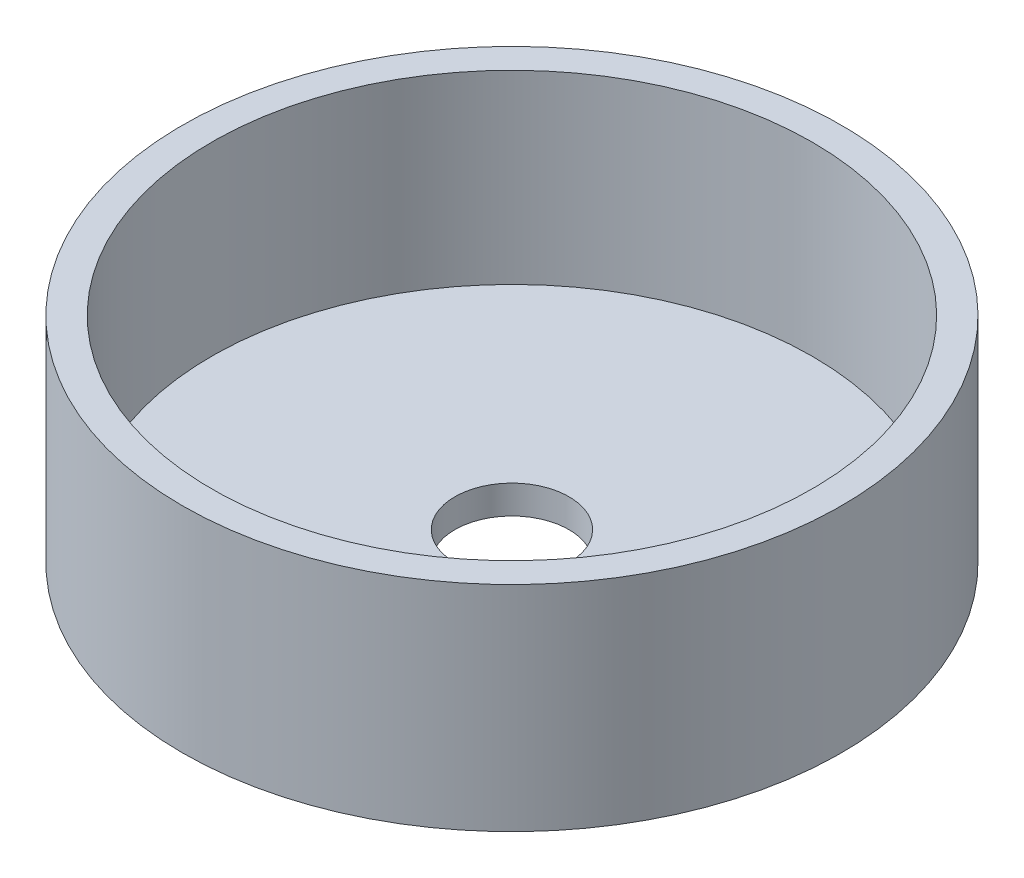
ISO-10303-21;
HEADER;
FILE_DESCRIPTION(('STEP AP214'),'2;1');
FILE_NAME('part.step','',(''),(''),'','','');
FILE_SCHEMA(('AUTOMOTIVE_DESIGN { 1 0 10303 214 1 1 1 1 }'));
ENDSEC;
DATA;
#1=APPLICATION_CONTEXT('core data for automotive mechanical design processes');
#2=APPLICATION_PROTOCOL_DEFINITION('international standard','automotive_design',2000,#1);
#3=PRODUCT_CONTEXT('',#1,'mechanical');
#4=PRODUCT('Part','Part','',(#3));
#5=PRODUCT_RELATED_PRODUCT_CATEGORY('part','',(#4));
#6=PRODUCT_DEFINITION_FORMATION('','',#4);
#7=PRODUCT_DEFINITION_CONTEXT('part definition',#1,'design');
#8=PRODUCT_DEFINITION('design','',#6,#7);
#9=PRODUCT_DEFINITION_SHAPE('','',#8);
#10=(LENGTH_UNIT() NAMED_UNIT(*) SI_UNIT(.MILLI.,.METRE.));
#11=(NAMED_UNIT(*) PLANE_ANGLE_UNIT() SI_UNIT($,.RADIAN.));
#12=(NAMED_UNIT(*) SI_UNIT($,.STERADIAN.) SOLID_ANGLE_UNIT());
#13=UNCERTAINTY_MEASURE_WITH_UNIT(LENGTH_MEASURE(1.E-05),#10,'distance_accuracy_value','');
#14=(GEOMETRIC_REPRESENTATION_CONTEXT(3) GLOBAL_UNCERTAINTY_ASSIGNED_CONTEXT((#13)) GLOBAL_UNIT_ASSIGNED_CONTEXT((#10,
#11,#12)) REPRESENTATION_CONTEXT('',''));
#15=CARTESIAN_POINT('',(0.,0.,0.));
#16=DIRECTION('',(0.,0.,1.));
#17=DIRECTION('',(1.,0.,0.));
#18=AXIS2_PLACEMENT_3D('',#15,#16,#17);
#19=CARTESIAN_POINT('',(0.,2.,0.));
#20=DIRECTION('',(0.,-1.,0.));
#21=DIRECTION('',(0.,0.,-1.));
#22=AXIS2_PLACEMENT_3D('',#19,#20,#21);
#23=CYLINDRICAL_SURFACE('',#22,23.1);
#24=CARTESIAN_POINT('',(0.,0.,0.));
#25=DIRECTION('',(0.,1.,0.));
#26=DIRECTION('',(0.,0.,1.));
#27=AXIS2_PLACEMENT_3D('',#24,#25,#26);
#28=CIRCLE('',#27,23.1);
#29=CARTESIAN_POINT('',(0.,0.,23.1));
#30=VERTEX_POINT('',#29);
#31=EDGE_CURVE('E40',#30,#30,#28,.T.);
#32=ORIENTED_EDGE('',*,*,#31,.T.);
#33=EDGE_LOOP('',(#32));
#34=FACE_BOUND('',#33,.T.);
#35=CARTESIAN_POINT('',(0.,15.,0.));
#36=DIRECTION('',(0.,1.,0.));
#37=DIRECTION('',(0.,0.,1.));
#38=AXIS2_PLACEMENT_3D('',#35,#36,#37);
#39=CIRCLE('',#38,23.1);
#40=CARTESIAN_POINT('',(0.,15.,23.1));
#41=VERTEX_POINT('',#40);
#42=EDGE_CURVE('E44',#41,#41,#39,.T.);
#43=ORIENTED_EDGE('',*,*,#42,.F.);
#44=EDGE_LOOP('',(#43));
#45=FACE_BOUND('',#44,.T.);
#46=ADVANCED_FACE('F34',(#34,#45),#23,.T.);
#47=CARTESIAN_POINT('',(0.,0.,0.));
#48=DIRECTION('',(0.,1.,0.));
#49=DIRECTION('',(0.,0.,1.));
#50=AXIS2_PLACEMENT_3D('',#47,#48,#49);
#51=PLANE('',#50);
#52=CARTESIAN_POINT('',(0.,0.,0.));
#53=DIRECTION('',(0.,1.,0.));
#54=DIRECTION('',(0.,0.,1.));
#55=AXIS2_PLACEMENT_3D('',#52,#53,#54);
#56=CIRCLE('',#55,4.);
#57=CARTESIAN_POINT('',(0.,0.,4.));
#58=VERTEX_POINT('',#57);
#59=EDGE_CURVE('E53',#58,#58,#56,.T.);
#60=ORIENTED_EDGE('',*,*,#59,.T.);
#61=EDGE_LOOP('',(#60));
#62=FACE_BOUND('',#61,.T.);
#63=ORIENTED_EDGE('',*,*,#31,.F.);
#64=EDGE_LOOP('',(#63));
#65=FACE_BOUND('',#64,.T.);
#66=ADVANCED_FACE('F60',(#62,#65),#51,.F.);
#67=CARTESIAN_POINT('',(0.,15.,0.));
#68=DIRECTION('',(0.,1.,0.));
#69=DIRECTION('',(0.,0.,1.));
#70=AXIS2_PLACEMENT_3D('',#67,#68,#69);
#71=PLANE('',#70);
#72=ORIENTED_EDGE('',*,*,#42,.T.);
#73=EDGE_LOOP('',(#72));
#74=FACE_BOUND('',#73,.T.);
#75=CARTESIAN_POINT('',(0.,15.,0.));
#76=DIRECTION('',(0.,1.,0.));
#77=DIRECTION('',(0.,0.,1.));
#78=AXIS2_PLACEMENT_3D('',#75,#76,#77);
#79=CIRCLE('',#78,21.05);
#80=CARTESIAN_POINT('',(0.,15.,-21.05));
#81=VERTEX_POINT('',#80);
#82=EDGE_CURVE('E48',#81,#81,#79,.T.);
#83=ORIENTED_EDGE('',*,*,#82,.F.);
#84=EDGE_LOOP('',(#83));
#85=FACE_BOUND('',#84,.T.);
#86=ADVANCED_FACE('F77',(#74,#85),#71,.T.);
#87=CARTESIAN_POINT('',(0.,15.,0.));
#88=DIRECTION('',(0.,-1.,0.));
#89=DIRECTION('',(0.,0.,-1.));
#90=AXIS2_PLACEMENT_3D('',#87,#88,#89);
#91=CYLINDRICAL_SURFACE('',#90,21.05);
#92=CARTESIAN_POINT('',(0.,2.,0.));
#93=DIRECTION('',(0.,1.,0.));
#94=DIRECTION('',(0.,0.,1.));
#95=AXIS2_PLACEMENT_3D('',#92,#93,#94);
#96=CIRCLE('',#95,21.05);
#97=CARTESIAN_POINT('',(0.,2.,-21.05));
#98=VERTEX_POINT('',#97);
#99=EDGE_CURVE('E10',#98,#98,#96,.F.);
#100=CARTESIAN_POINT('',(0.,15.,-21.05));
#101=CARTESIAN_POINT('',(0.,14.8645833333333,-21.05));
#102=CARTESIAN_POINT('',(0.,14.7291666666667,-21.05));
#103=CARTESIAN_POINT('',(0.,14.4583333333333,-21.05));
#104=CARTESIAN_POINT('',(0.,14.3229166666667,-21.05));
#105=CARTESIAN_POINT('',(0.,14.0520833333333,-21.05));
#106=CARTESIAN_POINT('',(0.,13.9166666666667,-21.05));
#107=CARTESIAN_POINT('',(0.,13.6458333333333,-21.05));
#108=CARTESIAN_POINT('',(0.,13.5104166666667,-21.05));
#109=CARTESIAN_POINT('',(0.,13.2395833333333,-21.05));
#110=CARTESIAN_POINT('',(0.,13.1041666666667,-21.05));
#111=CARTESIAN_POINT('',(0.,12.8333333333333,-21.05));
#112=CARTESIAN_POINT('',(0.,12.6979166666667,-21.05));
#113=CARTESIAN_POINT('',(0.,12.4270833333333,-21.05));
#114=CARTESIAN_POINT('',(0.,12.2916666666667,-21.05));
#115=CARTESIAN_POINT('',(0.,12.0208333333333,-21.05));
#116=CARTESIAN_POINT('',(0.,11.8854166666667,-21.05));
#117=CARTESIAN_POINT('',(0.,11.6145833333333,-21.05));
#118=CARTESIAN_POINT('',(0.,11.4791666666667,-21.05));
#119=CARTESIAN_POINT('',(0.,11.2083333333333,-21.05));
#120=CARTESIAN_POINT('',(0.,11.0729166666667,-21.05));
#121=CARTESIAN_POINT('',(0.,10.8020833333333,-21.05));
#122=CARTESIAN_POINT('',(0.,10.6666666666667,-21.05));
#123=CARTESIAN_POINT('',(0.,10.3958333333333,-21.05));
#124=CARTESIAN_POINT('',(0.,10.2604166666667,-21.05));
#125=CARTESIAN_POINT('',(0.,9.98958333333333,-21.05));
#126=CARTESIAN_POINT('',(0.,9.85416666666667,-21.05));
#127=CARTESIAN_POINT('',(0.,9.58333333333333,-21.05));
#128=CARTESIAN_POINT('',(0.,9.44791666666667,-21.05));
#129=CARTESIAN_POINT('',(0.,9.17708333333333,-21.05));
#130=CARTESIAN_POINT('',(0.,9.04166666666667,-21.05));
#131=CARTESIAN_POINT('',(0.,8.77083333333333,-21.05));
#132=CARTESIAN_POINT('',(0.,8.63541666666667,-21.05));
#133=CARTESIAN_POINT('',(0.,8.36458333333333,-21.05));
#134=CARTESIAN_POINT('',(0.,8.22916666666667,-21.05));
#135=CARTESIAN_POINT('',(0.,7.95833333333333,-21.05));
#136=CARTESIAN_POINT('',(0.,7.82291666666667,-21.05));
#137=CARTESIAN_POINT('',(0.,7.55208333333333,-21.05));
#138=CARTESIAN_POINT('',(0.,7.41666666666667,-21.05));
#139=CARTESIAN_POINT('',(0.,7.14583333333333,-21.05));
#140=CARTESIAN_POINT('',(0.,7.01041666666667,-21.05));
#141=CARTESIAN_POINT('',(0.,6.73958333333333,-21.05));
#142=CARTESIAN_POINT('',(0.,6.60416666666667,-21.05));
#143=CARTESIAN_POINT('',(0.,6.33333333333333,-21.05));
#144=CARTESIAN_POINT('',(0.,6.19791666666667,-21.05));
#145=CARTESIAN_POINT('',(0.,5.92708333333333,-21.05));
#146=CARTESIAN_POINT('',(0.,5.79166666666667,-21.05));
#147=CARTESIAN_POINT('',(0.,5.52083333333333,-21.05));
#148=CARTESIAN_POINT('',(0.,5.38541666666667,-21.05));
#149=CARTESIAN_POINT('',(0.,5.11458333333333,-21.05));
#150=CARTESIAN_POINT('',(0.,4.97916666666667,-21.05));
#151=CARTESIAN_POINT('',(0.,4.70833333333333,-21.05));
#152=CARTESIAN_POINT('',(0.,4.57291666666667,-21.05));
#153=CARTESIAN_POINT('',(0.,4.30208333333333,-21.05));
#154=CARTESIAN_POINT('',(0.,4.16666666666667,-21.05));
#155=CARTESIAN_POINT('',(0.,3.89583333333333,-21.05));
#156=CARTESIAN_POINT('',(0.,3.76041666666667,-21.05));
#157=CARTESIAN_POINT('',(0.,3.48958333333333,-21.05));
#158=CARTESIAN_POINT('',(0.,3.35416666666667,-21.05));
#159=CARTESIAN_POINT('',(0.,3.08333333333333,-21.05));
#160=CARTESIAN_POINT('',(0.,2.94791666666667,-21.05));
#161=CARTESIAN_POINT('',(0.,2.67708333333333,-21.05));
#162=CARTESIAN_POINT('',(0.,2.54166666666667,-21.05));
#163=CARTESIAN_POINT('',(0.,2.27083333333333,-21.05));
#164=CARTESIAN_POINT('',(0.,2.13541666666667,-21.05));
#165=CARTESIAN_POINT('',(0.,2.,-21.05));
#166=B_SPLINE_CURVE_WITH_KNOTS('',3,(#100,#101,#102,#103,#104,#105,#106,#107,#108,#109,#110,
#111,#112,#113,#114,#115,#116,#117,#118,#119,#120,#121,#122,#123,#124,#125,#126,#127,#128,#129,
#130,#131,#132,#133,#134,#135,#136,#137,#138,#139,#140,#141,#142,#143,#144,#145,#146,#147,#148,
#149,#150,#151,#152,#153,#154,#155,#156,#157,#158,#159,#160,#161,#162,#163,#164,#165),
.UNSPECIFIED.,.F.,.F.,(4,2,2,2,2,2,2,2,2,2,2,2,2,2,2,2,2,2,2,2,2,2,2,2,2,2,2,2,2,2,2,2,4),(0.,
0.406249999999999,0.812499999999999,1.21875,1.625,2.03125,2.4375,2.84375,3.25,3.65625,4.0625,
4.46875,4.875,5.28125,5.6875,6.09375,6.5,6.90625,7.3125,7.71875,8.125,8.53125,8.9375,9.34375,
9.75,10.15625,10.5625,10.96875,11.375,11.78125,12.1875,12.59375,13.),.UNSPECIFIED.);
#167=EDGE_CURVE('BSEAM72',#81,#98,#166,.T.);
#168=ORIENTED_EDGE('',*,*,#82,.T.);
#169=ORIENTED_EDGE('',*,*,#99,.T.);
#170=ORIENTED_EDGE('',*,*,#167,.T.);
#171=ORIENTED_EDGE('',*,*,#167,.F.);
#172=EDGE_LOOP('',(#168,#170,#169,#171));
#173=FACE_BOUND('',#172,.T.);
#174=ADVANCED_FACE('F72',(#173),#91,.F.);
#175=CARTESIAN_POINT('',(0.,2.,0.));
#176=DIRECTION('',(0.,1.,0.));
#177=DIRECTION('',(0.,0.,1.));
#178=AXIS2_PLACEMENT_3D('',#175,#176,#177);
#179=PLANE('',#178);
#180=CARTESIAN_POINT('',(0.,2.,0.));
#181=DIRECTION('',(0.,1.,0.));
#182=DIRECTION('',(0.,0.,1.));
#183=AXIS2_PLACEMENT_3D('',#180,#181,#182);
#184=CIRCLE('',#183,4.);
#185=CARTESIAN_POINT('',(0.,2.,4.));
#186=VERTEX_POINT('',#185);
#187=EDGE_CURVE('E54',#186,#186,#184,.T.);
#188=ORIENTED_EDGE('',*,*,#187,.F.);
#189=EDGE_LOOP('',(#188));
#190=FACE_BOUND('',#189,.T.);
#191=ORIENTED_EDGE('',*,*,#99,.F.);
#192=EDGE_LOOP('',(#191));
#193=FACE_BOUND('',#192,.T.);
#194=ADVANCED_FACE('F66',(#190,#193),#179,.T.);
#195=CARTESIAN_POINT('',(0.,0.,0.));
#196=DIRECTION('',(0.,1.,0.));
#197=DIRECTION('',(0.,0.,1.));
#198=AXIS2_PLACEMENT_3D('',#195,#196,#197);
#199=CYLINDRICAL_SURFACE('',#198,4.);
#200=ORIENTED_EDGE('',*,*,#59,.F.);
#201=EDGE_LOOP('',(#200));
#202=FACE_BOUND('',#201,.T.);
#203=ORIENTED_EDGE('',*,*,#187,.T.);
#204=EDGE_LOOP('',(#203));
#205=FACE_BOUND('',#204,.T.);
#206=ADVANCED_FACE('F63',(#202,#205),#199,.F.);
#207=CLOSED_SHELL('',(#46,#66,#86,#174,#194,#206));
#208=MANIFOLD_SOLID_BREP('B2',#207);
#209=ADVANCED_BREP_SHAPE_REPRESENTATION('',(#18,#208),#14);
#210=SHAPE_DEFINITION_REPRESENTATION(#9,#209);
ENDSEC;
END-ISO-10303-21;
